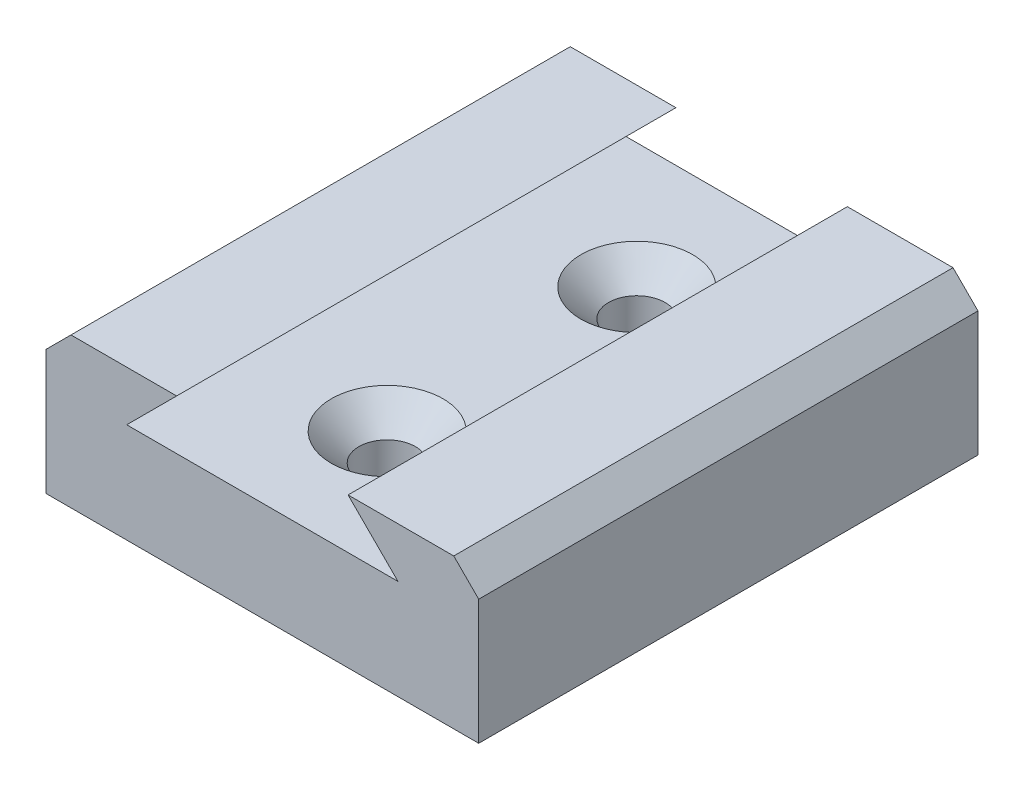
ISO-10303-21;
HEADER;
FILE_DESCRIPTION(('STEP AP214'),'2;1');
FILE_NAME('part.step','',(''),(''),'','','');
FILE_SCHEMA(('AUTOMOTIVE_DESIGN { 1 0 10303 214 1 1 1 1 }'));
ENDSEC;
DATA;
#1=APPLICATION_CONTEXT('core data for automotive mechanical design processes');
#2=APPLICATION_PROTOCOL_DEFINITION('international standard','automotive_design',2000,#1);
#3=PRODUCT_CONTEXT('',#1,'mechanical');
#4=PRODUCT('Part','Part','',(#3));
#5=PRODUCT_RELATED_PRODUCT_CATEGORY('part','',(#4));
#6=PRODUCT_DEFINITION_FORMATION('','',#4);
#7=PRODUCT_DEFINITION_CONTEXT('part definition',#1,'design');
#8=PRODUCT_DEFINITION('design','',#6,#7);
#9=PRODUCT_DEFINITION_SHAPE('','',#8);
#10=(LENGTH_UNIT() NAMED_UNIT(*) SI_UNIT(.MILLI.,.METRE.));
#11=(NAMED_UNIT(*) PLANE_ANGLE_UNIT() SI_UNIT($,.RADIAN.));
#12=(NAMED_UNIT(*) SI_UNIT($,.STERADIAN.) SOLID_ANGLE_UNIT());
#13=UNCERTAINTY_MEASURE_WITH_UNIT(LENGTH_MEASURE(1.E-05),#10,'distance_accuracy_value','');
#14=(GEOMETRIC_REPRESENTATION_CONTEXT(3) GLOBAL_UNCERTAINTY_ASSIGNED_CONTEXT((#13)) GLOBAL_UNIT_ASSIGNED_CONTEXT((#10,
#11,#12)) REPRESENTATION_CONTEXT('',''));
#15=CARTESIAN_POINT('',(0.,0.,0.));
#16=DIRECTION('',(0.,0.,1.));
#17=DIRECTION('',(1.,0.,0.));
#18=AXIS2_PLACEMENT_3D('',#15,#16,#17);
#19=CARTESIAN_POINT('',(8.15,6.,30.));
#20=DIRECTION('',(0.,-1.,0.));
#21=DIRECTION('',(0.,0.,-1.));
#22=AXIS2_PLACEMENT_3D('',#19,#20,#21);
#23=PLANE('',#22);
#24=CARTESIAN_POINT('',(0.,6.,22.5));
#25=DIRECTION('',(0.,1.,0.));
#26=DIRECTION('',(0.,0.,1.));
#27=AXIS2_PLACEMENT_3D('',#24,#25,#26);
#28=CIRCLE('',#27,3.36);
#29=CARTESIAN_POINT('',(0.,6.,25.86));
#30=VERTEX_POINT('',#29);
#31=EDGE_CURVE('E219',#30,#30,#28,.T.);
#32=ORIENTED_EDGE('',*,*,#31,.F.);
#33=EDGE_LOOP('',(#32));
#34=FACE_BOUND('',#33,.T.);
#35=DIRECTION('',(-1.,0.,0.));
#36=VECTOR('',#35,1.);
#37=CARTESIAN_POINT('',(8.15,6.,0.));
#38=LINE('',#37,#36);
#39=CARTESIAN_POINT('',(8.15,6.,0.));
#40=VERTEX_POINT('',#39);
#41=CARTESIAN_POINT('',(-8.15,6.,0.));
#42=VERTEX_POINT('',#41);
#43=EDGE_CURVE('E158',#40,#42,#38,.T.);
#44=ORIENTED_EDGE('',*,*,#43,.T.);
#45=DIRECTION('',(0.,0.,-1.));
#46=VECTOR('',#45,1.);
#47=CARTESIAN_POINT('',(-8.15,6.,30.));
#48=LINE('',#47,#46);
#49=CARTESIAN_POINT('',(-8.15,6.,30.));
#50=VERTEX_POINT('',#49);
#51=EDGE_CURVE('E174',#50,#42,#48,.T.);
#52=ORIENTED_EDGE('',*,*,#51,.F.);
#53=DIRECTION('',(-1.,0.,0.));
#54=VECTOR('',#53,1.);
#55=CARTESIAN_POINT('',(8.15,6.,30.));
#56=LINE('',#55,#54);
#57=CARTESIAN_POINT('',(8.15,6.,30.));
#58=VERTEX_POINT('',#57);
#59=EDGE_CURVE('E203',#58,#50,#56,.T.);
#60=ORIENTED_EDGE('',*,*,#59,.F.);
#61=DIRECTION('',(0.,0.,-1.));
#62=VECTOR('',#61,1.);
#63=CARTESIAN_POINT('',(8.15,6.,30.));
#64=LINE('',#63,#62);
#65=EDGE_CURVE('E177',#58,#40,#64,.T.);
#66=ORIENTED_EDGE('',*,*,#65,.T.);
#67=EDGE_LOOP('',(#44,#52,#60,#66));
#68=FACE_BOUND('',#67,.T.);
#69=CARTESIAN_POINT('',(0.,6.,7.5));
#70=DIRECTION('',(0.,1.,0.));
#71=DIRECTION('',(0.,0.,1.));
#72=AXIS2_PLACEMENT_3D('',#69,#70,#71);
#73=CIRCLE('',#72,3.36);
#74=CARTESIAN_POINT('',(0.,6.,10.86));
#75=VERTEX_POINT('',#74);
#76=EDGE_CURVE('E228',#75,#75,#73,.T.);
#77=ORIENTED_EDGE('',*,*,#76,.F.);
#78=EDGE_LOOP('',(#77));
#79=FACE_BOUND('',#78,.T.);
#80=ADVANCED_FACE('F39',(#34,#68,#79),#23,.F.);
#81=CARTESIAN_POINT('',(13.,0.,30.));
#82=DIRECTION('',(-1.,0.,0.));
#83=DIRECTION('',(0.,-1.,0.));
#84=AXIS2_PLACEMENT_3D('',#81,#82,#83);
#85=PLANE('',#84);
#86=DIRECTION('',(0.,1.,0.));
#87=VECTOR('',#86,1.);
#88=CARTESIAN_POINT('',(13.,0.,0.));
#89=LINE('',#88,#87);
#90=CARTESIAN_POINT('',(13.,0.,0.));
#91=VERTEX_POINT('',#90);
#92=CARTESIAN_POINT('',(13.,7.4999999999999,0.));
#93=VERTEX_POINT('',#92);
#94=EDGE_CURVE('E148',#91,#93,#89,.T.);
#95=ORIENTED_EDGE('',*,*,#94,.T.);
#96=DIRECTION('',(0.,0.,-1.));
#97=VECTOR('',#96,1.);
#98=CARTESIAN_POINT('',(13.,7.4999999999999,30.));
#99=LINE('',#98,#97);
#100=CARTESIAN_POINT('',(13.,7.4999999999999,30.));
#101=VERTEX_POINT('',#100);
#102=EDGE_CURVE('E11',#101,#93,#99,.T.);
#103=ORIENTED_EDGE('',*,*,#102,.F.);
#104=DIRECTION('',(0.,1.,0.));
#105=VECTOR('',#104,1.);
#106=CARTESIAN_POINT('',(13.,0.,30.));
#107=LINE('',#106,#105);
#108=CARTESIAN_POINT('',(13.,0.,30.));
#109=VERTEX_POINT('',#108);
#110=EDGE_CURVE('E167',#109,#101,#107,.T.);
#111=ORIENTED_EDGE('',*,*,#110,.F.);
#112=DIRECTION('',(0.,0.,-1.));
#113=VECTOR('',#112,1.);
#114=CARTESIAN_POINT('',(13.,0.,30.));
#115=LINE('',#114,#113);
#116=EDGE_CURVE('E144',#109,#91,#115,.T.);
#117=ORIENTED_EDGE('',*,*,#116,.T.);
#118=EDGE_LOOP('',(#95,#103,#111,#117));
#119=FACE_BOUND('',#118,.T.);
#120=ADVANCED_FACE('F41',(#119),#85,.F.);
#121=CARTESIAN_POINT('',(13.,7.4999999999999,30.));
#122=DIRECTION('',(-0.707106781186529,-0.707106781186565,0.));
#123=DIRECTION('',(0.707106781186566,-0.70710678118653,0.));
#124=AXIS2_PLACEMENT_3D('',#121,#122,#123);
#125=PLANE('',#124);
#126=DIRECTION('',(-0.707106781186565,0.707106781186529,0.));
#127=VECTOR('',#126,1.);
#128=CARTESIAN_POINT('',(13.,7.4999999999999,0.));
#129=LINE('',#128,#127);
#130=CARTESIAN_POINT('',(11.5,8.99999999999982,0.));
#131=VERTEX_POINT('',#130);
#132=EDGE_CURVE('E151',#93,#131,#129,.T.);
#133=ORIENTED_EDGE('',*,*,#132,.T.);
#134=DIRECTION('',(0.,0.,-1.));
#135=VECTOR('',#134,1.);
#136=CARTESIAN_POINT('',(11.5,8.99999999999982,30.));
#137=LINE('',#136,#135);
#138=CARTESIAN_POINT('',(11.5,8.99999999999982,30.));
#139=VERTEX_POINT('',#138);
#140=EDGE_CURVE('E48',#139,#131,#137,.T.);
#141=ORIENTED_EDGE('',*,*,#140,.F.);
#142=DIRECTION('',(-0.707106781186565,0.707106781186529,0.));
#143=VECTOR('',#142,1.);
#144=CARTESIAN_POINT('',(13.,7.4999999999999,30.));
#145=LINE('',#144,#143);
#146=EDGE_CURVE('E105',#101,#139,#145,.T.);
#147=ORIENTED_EDGE('',*,*,#146,.F.);
#148=ORIENTED_EDGE('',*,*,#102,.T.);
#149=EDGE_LOOP('',(#133,#141,#147,#148));
#150=FACE_BOUND('',#149,.T.);
#151=ADVANCED_FACE('F241',(#150),#125,.F.);
#152=CARTESIAN_POINT('',(11.5,8.99999999999982,30.));
#153=DIRECTION('',(0.,-1.,0.));
#154=DIRECTION('',(1.,0.,0.));
#155=AXIS2_PLACEMENT_3D('',#152,#153,#154);
#156=PLANE('',#155);
#157=DIRECTION('',(-1.,0.,0.));
#158=VECTOR('',#157,1.);
#159=CARTESIAN_POINT('',(11.5,8.99999999999982,0.));
#160=LINE('',#159,#158);
#161=CARTESIAN_POINT('',(5.15000000000002,8.99999999999982,0.));
#162=VERTEX_POINT('',#161);
#163=EDGE_CURVE('E154',#131,#162,#160,.T.);
#164=ORIENTED_EDGE('',*,*,#163,.T.);
#165=DIRECTION('',(0.,0.,-1.));
#166=VECTOR('',#165,1.);
#167=CARTESIAN_POINT('',(5.15000000000002,8.99999999999982,30.));
#168=LINE('',#167,#166);
#169=CARTESIAN_POINT('',(5.15000000000002,8.99999999999982,30.));
#170=VERTEX_POINT('',#169);
#171=EDGE_CURVE('E180',#170,#162,#168,.T.);
#172=ORIENTED_EDGE('',*,*,#171,.F.);
#173=DIRECTION('',(-1.,0.,0.));
#174=VECTOR('',#173,1.);
#175=CARTESIAN_POINT('',(11.5,8.99999999999982,30.));
#176=LINE('',#175,#174);
#177=EDGE_CURVE('E188',#139,#170,#176,.T.);
#178=ORIENTED_EDGE('',*,*,#177,.F.);
#179=ORIENTED_EDGE('',*,*,#140,.T.);
#180=EDGE_LOOP('',(#164,#172,#178,#179));
#181=FACE_BOUND('',#180,.T.);
#182=ADVANCED_FACE('F186',(#181),#156,.F.);
#183=CARTESIAN_POINT('',(5.15000000000002,8.99999999999982,30.));
#184=DIRECTION('',(0.70710678118653,0.707106781186565,0.));
#185=DIRECTION('',(-0.707106781186565,0.70710678118653,0.));
#186=AXIS2_PLACEMENT_3D('',#183,#184,#185);
#187=PLANE('',#186);
#188=DIRECTION('',(0.707106781186565,-0.70710678118653,0.));
#189=VECTOR('',#188,1.);
#190=CARTESIAN_POINT('',(5.15000000000002,8.99999999999982,0.));
#191=LINE('',#190,#189);
#192=EDGE_CURVE('E156',#162,#40,#191,.T.);
#193=ORIENTED_EDGE('',*,*,#192,.T.);
#194=ORIENTED_EDGE('',*,*,#65,.F.);
#195=DIRECTION('',(0.707106781186565,-0.70710678118653,0.));
#196=VECTOR('',#195,1.);
#197=CARTESIAN_POINT('',(5.15000000000002,8.99999999999982,30.));
#198=LINE('',#197,#196);
#199=EDGE_CURVE('E206',#170,#58,#198,.T.);
#200=ORIENTED_EDGE('',*,*,#199,.F.);
#201=ORIENTED_EDGE('',*,*,#171,.T.);
#202=EDGE_LOOP('',(#193,#194,#200,#201));
#203=FACE_BOUND('',#202,.T.);
#204=ADVANCED_FACE('F197',(#203),#187,.F.);
#205=CARTESIAN_POINT('',(-8.15,6.,30.));
#206=DIRECTION('',(-0.707106781186523,0.707106781186572,0.));
#207=DIRECTION('',(-0.707106781186572,-0.707106781186523,0.));
#208=AXIS2_PLACEMENT_3D('',#205,#206,#207);
#209=PLANE('',#208);
#210=DIRECTION('',(0.707106781186572,0.707106781186523,0.));
#211=VECTOR('',#210,1.);
#212=CARTESIAN_POINT('',(-8.15,6.,0.));
#213=LINE('',#212,#211);
#214=CARTESIAN_POINT('',(-5.14999999999997,8.99999999999982,0.));
#215=VERTEX_POINT('',#214);
#216=EDGE_CURVE('E160',#42,#215,#213,.T.);
#217=ORIENTED_EDGE('',*,*,#216,.T.);
#218=DIRECTION('',(0.,0.,-1.));
#219=VECTOR('',#218,1.);
#220=CARTESIAN_POINT('',(-5.14999999999997,8.99999999999982,30.));
#221=LINE('',#220,#219);
#222=CARTESIAN_POINT('',(-5.14999999999997,8.99999999999982,30.));
#223=VERTEX_POINT('',#222);
#224=EDGE_CURVE('E171',#223,#215,#221,.T.);
#225=ORIENTED_EDGE('',*,*,#224,.F.);
#226=DIRECTION('',(0.707106781186572,0.707106781186523,0.));
#227=VECTOR('',#226,1.);
#228=CARTESIAN_POINT('',(-8.15,6.,30.));
#229=LINE('',#228,#227);
#230=EDGE_CURVE('E205',#50,#223,#229,.T.);
#231=ORIENTED_EDGE('',*,*,#230,.F.);
#232=ORIENTED_EDGE('',*,*,#51,.T.);
#233=EDGE_LOOP('',(#217,#225,#231,#232));
#234=FACE_BOUND('',#233,.T.);
#235=ADVANCED_FACE('F246',(#234),#209,.F.);
#236=CARTESIAN_POINT('',(-5.14999999999997,8.99999999999982,30.));
#237=DIRECTION('',(0.,-1.,0.));
#238=DIRECTION('',(1.,0.,0.));
#239=AXIS2_PLACEMENT_3D('',#236,#237,#238);
#240=PLANE('',#239);
#241=DIRECTION('',(-1.,0.,0.));
#242=VECTOR('',#241,1.);
#243=CARTESIAN_POINT('',(-5.14999999999997,8.99999999999982,0.));
#244=LINE('',#243,#242);
#245=CARTESIAN_POINT('',(-11.5,8.99999999999982,0.));
#246=VERTEX_POINT('',#245);
#247=EDGE_CURVE('E162',#215,#246,#244,.T.);
#248=ORIENTED_EDGE('',*,*,#247,.T.);
#249=DIRECTION('',(0.,0.,-1.));
#250=VECTOR('',#249,1.);
#251=CARTESIAN_POINT('',(-11.5,8.99999999999982,30.));
#252=LINE('',#251,#250);
#253=CARTESIAN_POINT('',(-11.5,8.99999999999982,30.));
#254=VERTEX_POINT('',#253);
#255=EDGE_CURVE('E139',#254,#246,#252,.T.);
#256=ORIENTED_EDGE('',*,*,#255,.F.);
#257=DIRECTION('',(-1.,0.,0.));
#258=VECTOR('',#257,1.);
#259=CARTESIAN_POINT('',(-5.14999999999997,8.99999999999982,30.));
#260=LINE('',#259,#258);
#261=EDGE_CURVE('E130',#223,#254,#260,.T.);
#262=ORIENTED_EDGE('',*,*,#261,.F.);
#263=ORIENTED_EDGE('',*,*,#224,.T.);
#264=EDGE_LOOP('',(#248,#256,#262,#263));
#265=FACE_BOUND('',#264,.T.);
#266=ADVANCED_FACE('F258',(#265),#240,.F.);
#267=CARTESIAN_POINT('',(-11.5,8.99999999999982,30.));
#268=DIRECTION('',(0.707106781186522,-0.707106781186572,0.));
#269=DIRECTION('',(0.707106781186573,0.707106781186523,0.));
#270=AXIS2_PLACEMENT_3D('',#267,#268,#269);
#271=PLANE('',#270);
#272=DIRECTION('',(-0.707106781186573,-0.707106781186523,0.));
#273=VECTOR('',#272,1.);
#274=CARTESIAN_POINT('',(-11.5,8.99999999999982,0.));
#275=LINE('',#274,#273);
#276=CARTESIAN_POINT('',(-13.,7.49999999999992,0.));
#277=VERTEX_POINT('',#276);
#278=EDGE_CURVE('E138',#246,#277,#275,.T.);
#279=ORIENTED_EDGE('',*,*,#278,.T.);
#280=DIRECTION('',(0.,0.,-1.));
#281=VECTOR('',#280,1.);
#282=CARTESIAN_POINT('',(-13.,7.49999999999992,30.));
#283=LINE('',#282,#281);
#284=CARTESIAN_POINT('',(-13.,7.49999999999992,30.));
#285=VERTEX_POINT('',#284);
#286=EDGE_CURVE('E135',#285,#277,#283,.T.);
#287=ORIENTED_EDGE('',*,*,#286,.F.);
#288=DIRECTION('',(-0.707106781186573,-0.707106781186523,0.));
#289=VECTOR('',#288,1.);
#290=CARTESIAN_POINT('',(-11.5,8.99999999999982,30.));
#291=LINE('',#290,#289);
#292=EDGE_CURVE('E124',#254,#285,#291,.T.);
#293=ORIENTED_EDGE('',*,*,#292,.F.);
#294=ORIENTED_EDGE('',*,*,#255,.T.);
#295=EDGE_LOOP('',(#279,#287,#293,#294));
#296=FACE_BOUND('',#295,.T.);
#297=ADVANCED_FACE('F136',(#296),#271,.F.);
#298=CARTESIAN_POINT('',(-13.,7.49999999999992,30.));
#299=DIRECTION('',(1.,0.,0.));
#300=DIRECTION('',(0.,1.,0.));
#301=AXIS2_PLACEMENT_3D('',#298,#299,#300);
#302=PLANE('',#301);
#303=DIRECTION('',(0.,-1.,0.));
#304=VECTOR('',#303,1.);
#305=CARTESIAN_POINT('',(-13.,7.49999999999992,0.));
#306=LINE('',#305,#304);
#307=CARTESIAN_POINT('',(-13.,0.,0.));
#308=VERTEX_POINT('',#307);
#309=EDGE_CURVE('E91',#277,#308,#306,.T.);
#310=ORIENTED_EDGE('',*,*,#309,.T.);
#311=DIRECTION('',(0.,0.,-1.));
#312=VECTOR('',#311,1.);
#313=CARTESIAN_POINT('',(-13.,0.,30.));
#314=LINE('',#313,#312);
#315=CARTESIAN_POINT('',(-13.,0.,30.));
#316=VERTEX_POINT('',#315);
#317=EDGE_CURVE('E140',#316,#308,#314,.T.);
#318=ORIENTED_EDGE('',*,*,#317,.F.);
#319=DIRECTION('',(0.,-1.,0.));
#320=VECTOR('',#319,1.);
#321=CARTESIAN_POINT('',(-13.,7.49999999999992,30.));
#322=LINE('',#321,#320);
#323=EDGE_CURVE('E128',#285,#316,#322,.T.);
#324=ORIENTED_EDGE('',*,*,#323,.F.);
#325=ORIENTED_EDGE('',*,*,#286,.T.);
#326=EDGE_LOOP('',(#310,#318,#324,#325));
#327=FACE_BOUND('',#326,.T.);
#328=ADVANCED_FACE('F142',(#327),#302,.F.);
#329=CARTESIAN_POINT('',(-13.,0.,30.));
#330=DIRECTION('',(0.,1.,0.));
#331=DIRECTION('',(0.,0.,1.));
#332=AXIS2_PLACEMENT_3D('',#329,#330,#331);
#333=PLANE('',#332);
#334=CARTESIAN_POINT('',(0.,0.,7.5));
#335=DIRECTION('',(0.,1.,0.));
#336=DIRECTION('',(0.,0.,1.));
#337=AXIS2_PLACEMENT_3D('',#334,#335,#336);
#338=CIRCLE('',#337,1.7);
#339=CARTESIAN_POINT('',(0.,0.,9.2));
#340=VERTEX_POINT('',#339);
#341=EDGE_CURVE('E222',#340,#340,#338,.T.);
#342=ORIENTED_EDGE('',*,*,#341,.T.);
#343=EDGE_LOOP('',(#342));
#344=FACE_BOUND('',#343,.T.);
#345=CARTESIAN_POINT('',(0.,0.,22.5));
#346=DIRECTION('',(0.,1.,0.));
#347=DIRECTION('',(0.,0.,1.));
#348=AXIS2_PLACEMENT_3D('',#345,#346,#347);
#349=CIRCLE('',#348,1.7);
#350=CARTESIAN_POINT('',(0.,0.,24.2));
#351=VERTEX_POINT('',#350);
#352=EDGE_CURVE('E152',#351,#351,#349,.T.);
#353=ORIENTED_EDGE('',*,*,#352,.T.);
#354=EDGE_LOOP('',(#353));
#355=FACE_BOUND('',#354,.T.);
#356=DIRECTION('',(1.,0.,0.));
#357=VECTOR('',#356,1.);
#358=CARTESIAN_POINT('',(-13.,0.,0.));
#359=LINE('',#358,#357);
#360=EDGE_CURVE('E97',#308,#91,#359,.T.);
#361=ORIENTED_EDGE('',*,*,#360,.T.);
#362=ORIENTED_EDGE('',*,*,#116,.F.);
#363=DIRECTION('',(1.,0.,0.));
#364=VECTOR('',#363,1.);
#365=CARTESIAN_POINT('',(-13.,0.,30.));
#366=LINE('',#365,#364);
#367=EDGE_CURVE('E56',#316,#109,#366,.T.);
#368=ORIENTED_EDGE('',*,*,#367,.F.);
#369=ORIENTED_EDGE('',*,*,#317,.T.);
#370=EDGE_LOOP('',(#361,#362,#368,#369));
#371=FACE_BOUND('',#370,.T.);
#372=ADVANCED_FACE('F272',(#344,#355,#371),#333,.F.);
#373=CARTESIAN_POINT('',(0.,0.,30.));
#374=DIRECTION('',(0.,0.,1.));
#375=DIRECTION('',(1.,0.,0.));
#376=AXIS2_PLACEMENT_3D('',#373,#374,#375);
#377=PLANE('',#376);
#378=ORIENTED_EDGE('',*,*,#110,.T.);
#379=ORIENTED_EDGE('',*,*,#146,.T.);
#380=ORIENTED_EDGE('',*,*,#177,.T.);
#381=ORIENTED_EDGE('',*,*,#199,.T.);
#382=ORIENTED_EDGE('',*,*,#59,.T.);
#383=ORIENTED_EDGE('',*,*,#230,.T.);
#384=ORIENTED_EDGE('',*,*,#261,.T.);
#385=ORIENTED_EDGE('',*,*,#292,.T.);
#386=ORIENTED_EDGE('',*,*,#323,.T.);
#387=ORIENTED_EDGE('',*,*,#367,.T.);
#388=EDGE_LOOP('',(#378,#379,#380,#381,#382,#383,#384,#385,#386,#387));
#389=FACE_BOUND('',#388,.T.);
#390=ADVANCED_FACE('F126',(#389),#377,.T.);
#391=CARTESIAN_POINT('',(0.,0.,0.));
#392=DIRECTION('',(0.,0.,1.));
#393=DIRECTION('',(1.,0.,0.));
#394=AXIS2_PLACEMENT_3D('',#391,#392,#393);
#395=PLANE('',#394);
#396=ORIENTED_EDGE('',*,*,#94,.F.);
#397=ORIENTED_EDGE('',*,*,#360,.F.);
#398=ORIENTED_EDGE('',*,*,#309,.F.);
#399=ORIENTED_EDGE('',*,*,#278,.F.);
#400=ORIENTED_EDGE('',*,*,#247,.F.);
#401=ORIENTED_EDGE('',*,*,#216,.F.);
#402=ORIENTED_EDGE('',*,*,#43,.F.);
#403=ORIENTED_EDGE('',*,*,#192,.F.);
#404=ORIENTED_EDGE('',*,*,#163,.F.);
#405=ORIENTED_EDGE('',*,*,#132,.F.);
#406=EDGE_LOOP('',(#396,#397,#398,#399,#400,#401,#402,#403,#404,#405));
#407=FACE_BOUND('',#406,.T.);
#408=ADVANCED_FACE('F192',(#407),#395,.F.);
#409=CARTESIAN_POINT('',(0.,6.,22.5));
#410=DIRECTION('',(0.,1.,0.));
#411=DIRECTION('',(0.,0.,1.));
#412=AXIS2_PLACEMENT_3D('',#409,#410,#411);
#413=CYLINDRICAL_SURFACE('',#412,1.7);
#414=ORIENTED_EDGE('',*,*,#352,.F.);
#415=EDGE_LOOP('',(#414));
#416=FACE_BOUND('',#415,.T.);
#417=CARTESIAN_POINT('',(0.,4.34,22.5));
#418=DIRECTION('',(0.,1.,0.));
#419=DIRECTION('',(0.,0.,1.));
#420=AXIS2_PLACEMENT_3D('',#417,#418,#419);
#421=CIRCLE('',#420,1.7);
#422=CARTESIAN_POINT('',(0.,4.34,24.2));
#423=VERTEX_POINT('',#422);
#424=EDGE_CURVE('E216',#423,#423,#421,.T.);
#425=ORIENTED_EDGE('',*,*,#424,.T.);
#426=EDGE_LOOP('',(#425));
#427=FACE_BOUND('',#426,.T.);
#428=ADVANCED_FACE('F276',(#416,#427),#413,.F.);
#429=CARTESIAN_POINT('',(0.,6.,22.5));
#430=DIRECTION('',(0.,1.,0.));
#431=DIRECTION('',(0.,0.,1.));
#432=AXIS2_PLACEMENT_3D('',#429,#430,#431);
#433=CONICAL_SURFACE('',#432,3.36,0.785398163397449);
#434=ORIENTED_EDGE('',*,*,#424,.F.);
#435=EDGE_LOOP('',(#434));
#436=FACE_BOUND('',#435,.T.);
#437=ORIENTED_EDGE('',*,*,#31,.T.);
#438=EDGE_LOOP('',(#437));
#439=FACE_BOUND('',#438,.T.);
#440=ADVANCED_FACE('F281',(#436,#439),#433,.F.);
#441=CARTESIAN_POINT('',(0.,6.,7.5));
#442=DIRECTION('',(0.,1.,0.));
#443=DIRECTION('',(0.,0.,1.));
#444=AXIS2_PLACEMENT_3D('',#441,#442,#443);
#445=CYLINDRICAL_SURFACE('',#444,1.7);
#446=ORIENTED_EDGE('',*,*,#341,.F.);
#447=EDGE_LOOP('',(#446));
#448=FACE_BOUND('',#447,.T.);
#449=CARTESIAN_POINT('',(0.,4.34,7.5));
#450=DIRECTION('',(0.,1.,0.));
#451=DIRECTION('',(0.,0.,1.));
#452=AXIS2_PLACEMENT_3D('',#449,#450,#451);
#453=CIRCLE('',#452,1.7);
#454=CARTESIAN_POINT('',(0.,4.34,9.2));
#455=VERTEX_POINT('',#454);
#456=EDGE_CURVE('E225',#455,#455,#453,.T.);
#457=ORIENTED_EDGE('',*,*,#456,.T.);
#458=EDGE_LOOP('',(#457));
#459=FACE_BOUND('',#458,.T.);
#460=ADVANCED_FACE('F285',(#448,#459),#445,.F.);
#461=CARTESIAN_POINT('',(0.,6.,7.5));
#462=DIRECTION('',(0.,1.,0.));
#463=DIRECTION('',(0.,0.,1.));
#464=AXIS2_PLACEMENT_3D('',#461,#462,#463);
#465=CONICAL_SURFACE('',#464,3.36,0.785398163397449);
#466=ORIENTED_EDGE('',*,*,#456,.F.);
#467=EDGE_LOOP('',(#466));
#468=FACE_BOUND('',#467,.T.);
#469=ORIENTED_EDGE('',*,*,#76,.T.);
#470=EDGE_LOOP('',(#469));
#471=FACE_BOUND('',#470,.T.);
#472=ADVANCED_FACE('F232',(#468,#471),#465,.F.);
#473=CLOSED_SHELL('',(#80,#120,#151,#182,#204,#235,#266,#297,#328,#372,#390,#408,#428,#440,#460,#472));
#474=MANIFOLD_SOLID_BREP('B2',#473);
#475=ADVANCED_BREP_SHAPE_REPRESENTATION('',(#18,#474),#14);
#476=SHAPE_DEFINITION_REPRESENTATION(#9,#475);
ENDSEC;
END-ISO-10303-21;
